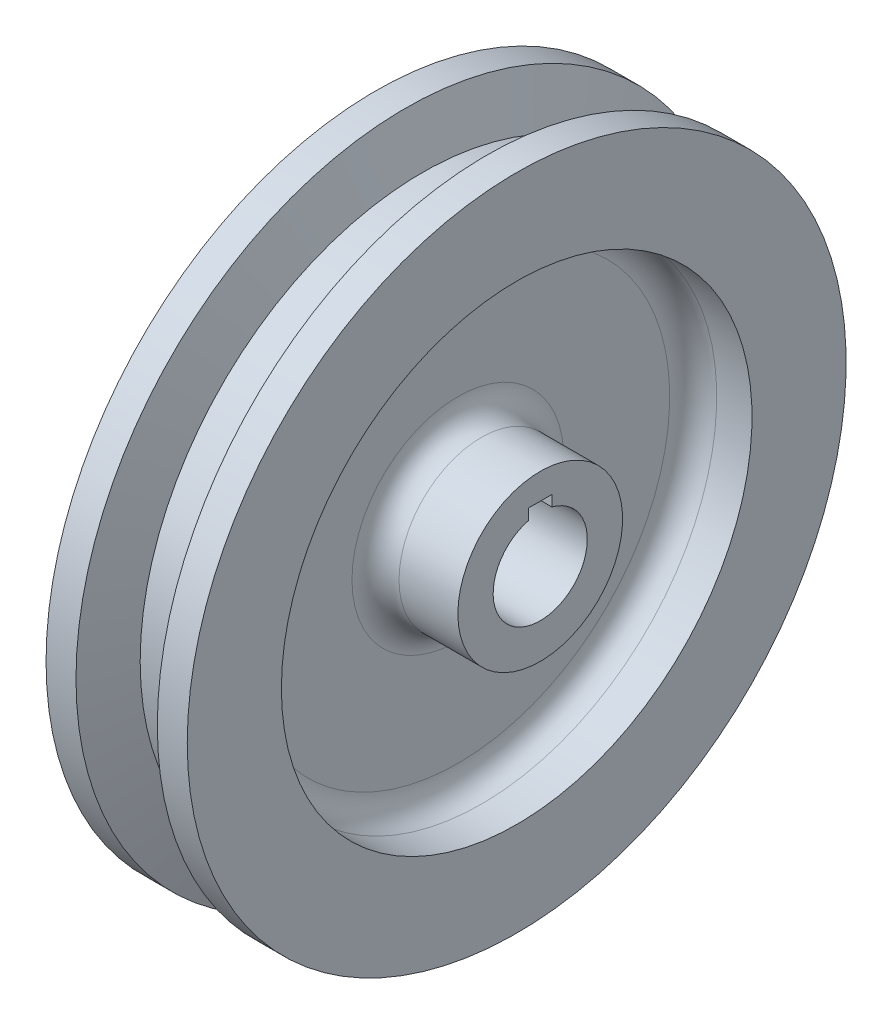
ISO-10303-21;
HEADER;
FILE_DESCRIPTION(('STEP AP214'),'2;1');
FILE_NAME('part.step','',(''),(''),'','','');
FILE_SCHEMA(('AUTOMOTIVE_DESIGN { 1 0 10303 214 1 1 1 1 }'));
ENDSEC;
DATA;
#1=APPLICATION_CONTEXT('core data for automotive mechanical design processes');
#2=APPLICATION_PROTOCOL_DEFINITION('international standard','automotive_design',2000,#1);
#3=PRODUCT_CONTEXT('',#1,'mechanical');
#4=PRODUCT('Part','Part','',(#3));
#5=PRODUCT_RELATED_PRODUCT_CATEGORY('part','',(#4));
#6=PRODUCT_DEFINITION_FORMATION('','',#4);
#7=PRODUCT_DEFINITION_CONTEXT('part definition',#1,'design');
#8=PRODUCT_DEFINITION('design','',#6,#7);
#9=PRODUCT_DEFINITION_SHAPE('','',#8);
#10=(LENGTH_UNIT() NAMED_UNIT(*) SI_UNIT(.MILLI.,.METRE.));
#11=(NAMED_UNIT(*) PLANE_ANGLE_UNIT() SI_UNIT($,.RADIAN.));
#12=(NAMED_UNIT(*) SI_UNIT($,.STERADIAN.) SOLID_ANGLE_UNIT());
#13=UNCERTAINTY_MEASURE_WITH_UNIT(LENGTH_MEASURE(1.E-05),#10,'distance_accuracy_value','');
#14=(GEOMETRIC_REPRESENTATION_CONTEXT(3) GLOBAL_UNCERTAINTY_ASSIGNED_CONTEXT((#13)) GLOBAL_UNIT_ASSIGNED_CONTEXT((#10,
#11,#12)) REPRESENTATION_CONTEXT('',''));
#15=CARTESIAN_POINT('',(0.,0.,0.));
#16=DIRECTION('',(0.,0.,1.));
#17=DIRECTION('',(1.,0.,0.));
#18=AXIS2_PLACEMENT_3D('',#15,#16,#17);
#19=CARTESIAN_POINT('',(-25.4,9.525,0.));
#20=DIRECTION('',(1.,0.,0.));
#21=DIRECTION('',(0.,0.,-1.));
#22=AXIS2_PLACEMENT_3D('',#19,#20,#21);
#23=PLANE('',#22);
#24=CARTESIAN_POINT('',(-25.4,-12.7,0.));
#25=DIRECTION('',(-1.,0.,0.));
#26=DIRECTION('',(0.,0.,1.));
#27=AXIS2_PLACEMENT_3D('',#24,#25,#26);
#28=CIRCLE('',#27,22.225);
#29=CARTESIAN_POINT('',(-25.4,-12.7,22.225));
#30=VERTEX_POINT('',#29);
#31=EDGE_CURVE('E11',#30,#30,#28,.T.);
#32=ORIENTED_EDGE('',*,*,#31,.T.);
#33=EDGE_LOOP('',(#32));
#34=FACE_BOUND('',#33,.T.);
#35=DIRECTION('',(0.,1.,0.));
#36=VECTOR('',#35,1.);
#37=CARTESIAN_POINT('',(-25.4,-0.403277875791438,3.17499999999999));
#38=LINE('',#37,#36);
#39=CARTESIAN_POINT('',(-25.4,-0.403277875791438,3.17499999999999));
#40=VERTEX_POINT('',#39);
#41=CARTESIAN_POINT('',(-25.4,2.54,3.17499999999999));
#42=VERTEX_POINT('',#41);
#43=EDGE_CURVE('E77',#40,#42,#38,.T.);
#44=ORIENTED_EDGE('',*,*,#43,.F.);
#45=CARTESIAN_POINT('',(-25.4,-12.7,0.));
#46=DIRECTION('',(-1.,0.,0.));
#47=DIRECTION('',(0.,0.,1.));
#48=AXIS2_PLACEMENT_3D('',#45,#46,#47);
#49=CIRCLE('',#48,12.7);
#50=CARTESIAN_POINT('',(-25.4,-0.403277875791454,-3.17500000000001));
#51=VERTEX_POINT('',#50);
#52=EDGE_CURVE('E80',#51,#40,#49,.T.);
#53=ORIENTED_EDGE('',*,*,#52,.F.);
#54=DIRECTION('',(0.,-1.,0.));
#55=VECTOR('',#54,1.);
#56=CARTESIAN_POINT('',(-25.4,2.54,-3.17500000000001));
#57=LINE('',#56,#55);
#58=CARTESIAN_POINT('',(-25.4,2.54,-3.17500000000001));
#59=VERTEX_POINT('',#58);
#60=EDGE_CURVE('E47',#59,#51,#57,.T.);
#61=ORIENTED_EDGE('',*,*,#60,.F.);
#62=DIRECTION('',(0.,0.,-1.));
#63=VECTOR('',#62,1.);
#64=CARTESIAN_POINT('',(-25.4,2.54,3.17499999999999));
#65=LINE('',#64,#63);
#66=EDGE_CURVE('E99',#42,#59,#65,.T.);
#67=ORIENTED_EDGE('',*,*,#66,.F.);
#68=EDGE_LOOP('',(#44,#53,#61,#67));
#69=FACE_BOUND('',#68,.T.);
#70=ADVANCED_FACE('F33',(#34,#69),#23,.F.);
#71=CARTESIAN_POINT('',(25.4,0.,0.));
#72=DIRECTION('',(-1.,0.,0.));
#73=DIRECTION('',(0.,0.,1.));
#74=AXIS2_PLACEMENT_3D('',#71,#72,#73);
#75=PLANE('',#74);
#76=CARTESIAN_POINT('',(25.4,-12.7,0.));
#77=DIRECTION('',(-1.,0.,0.));
#78=DIRECTION('',(0.,0.,1.));
#79=AXIS2_PLACEMENT_3D('',#76,#77,#78);
#80=CIRCLE('',#79,22.225);
#81=CARTESIAN_POINT('',(25.4,-12.7,22.225));
#82=VERTEX_POINT('',#81);
#83=EDGE_CURVE('E109',#82,#82,#80,.T.);
#84=ORIENTED_EDGE('',*,*,#83,.F.);
#85=EDGE_LOOP('',(#84));
#86=FACE_BOUND('',#85,.T.);
#87=DIRECTION('',(0.,1.,0.));
#88=VECTOR('',#87,1.);
#89=CARTESIAN_POINT('',(25.4,-0.403277875791438,3.17499999999999));
#90=LINE('',#89,#88);
#91=CARTESIAN_POINT('',(25.4,-0.403277875791438,3.17499999999999));
#92=VERTEX_POINT('',#91);
#93=CARTESIAN_POINT('',(25.4,2.54,3.17499999999999));
#94=VERTEX_POINT('',#93);
#95=EDGE_CURVE('E76',#92,#94,#90,.T.);
#96=ORIENTED_EDGE('',*,*,#95,.T.);
#97=DIRECTION('',(0.,0.,-1.));
#98=VECTOR('',#97,1.);
#99=CARTESIAN_POINT('',(25.4,2.54,3.17499999999999));
#100=LINE('',#99,#98);
#101=CARTESIAN_POINT('',(25.4,2.54,-3.17500000000001));
#102=VERTEX_POINT('',#101);
#103=EDGE_CURVE('E84',#94,#102,#100,.T.);
#104=ORIENTED_EDGE('',*,*,#103,.T.);
#105=DIRECTION('',(0.,-1.,0.));
#106=VECTOR('',#105,1.);
#107=CARTESIAN_POINT('',(25.4,2.54,-3.17500000000001));
#108=LINE('',#107,#106);
#109=CARTESIAN_POINT('',(25.4,-0.403277875791437,-3.17500000000001));
#110=VERTEX_POINT('',#109);
#111=EDGE_CURVE('E89',#102,#110,#108,.T.);
#112=ORIENTED_EDGE('',*,*,#111,.T.);
#113=CARTESIAN_POINT('',(25.4,-12.7,0.));
#114=DIRECTION('',(-1.,0.,0.));
#115=DIRECTION('',(0.,0.,1.));
#116=AXIS2_PLACEMENT_3D('',#113,#114,#115);
#117=CIRCLE('',#116,12.7);
#118=EDGE_CURVE('E94',#110,#92,#117,.T.);
#119=ORIENTED_EDGE('',*,*,#118,.T.);
#120=EDGE_LOOP('',(#96,#104,#112,#119));
#121=FACE_BOUND('',#120,.T.);
#122=ADVANCED_FACE('F92',(#86,#121),#75,.F.);
#123=CARTESIAN_POINT('',(-43.2740740740741,-12.7,0.));
#124=DIRECTION('',(-1.,0.,0.));
#125=DIRECTION('',(0.,0.,1.));
#126=AXIS2_PLACEMENT_3D('',#123,#124,#125);
#127=CYLINDRICAL_SURFACE('',#126,22.225);
#128=ORIENTED_EDGE('',*,*,#31,.F.);
#129=EDGE_LOOP('',(#128));
#130=FACE_BOUND('',#129,.T.);
#131=CARTESIAN_POINT('',(-9.52500000000004,-12.7,0.));
#132=DIRECTION('',(-1.,0.,0.));
#133=DIRECTION('',(0.,0.,1.));
#134=AXIS2_PLACEMENT_3D('',#131,#132,#133);
#135=CIRCLE('',#134,22.225);
#136=CARTESIAN_POINT('',(-9.52500000000004,-12.7,22.225));
#137=VERTEX_POINT('',#136);
#138=EDGE_CURVE('E40',#137,#137,#135,.T.);
#139=ORIENTED_EDGE('',*,*,#138,.T.);
#140=EDGE_LOOP('',(#139));
#141=FACE_BOUND('',#140,.T.);
#142=ADVANCED_FACE('F159',(#130,#141),#127,.T.);
#143=CARTESIAN_POINT('',(-9.525,-12.7,0.));
#144=DIRECTION('',(-1.,0.,0.));
#145=DIRECTION('',(0.,0.,1.));
#146=AXIS2_PLACEMENT_3D('',#143,#144,#145);
#147=TOROIDAL_SURFACE('',#146,28.575,6.35);
#148=ORIENTED_EDGE('',*,*,#138,.F.);
#149=EDGE_LOOP('',(#148));
#150=FACE_BOUND('',#149,.T.);
#151=CARTESIAN_POINT('',(-3.175,-12.7,0.));
#152=DIRECTION('',(-1.,0.,0.));
#153=DIRECTION('',(0.,0.,1.));
#154=AXIS2_PLACEMENT_3D('',#151,#152,#153);
#155=CIRCLE('',#154,28.575);
#156=CARTESIAN_POINT('',(-3.175,-12.7,28.575));
#157=VERTEX_POINT('',#156);
#158=EDGE_CURVE('E154',#157,#157,#155,.T.);
#159=ORIENTED_EDGE('',*,*,#158,.T.);
#160=EDGE_LOOP('',(#159));
#161=FACE_BOUND('',#160,.T.);
#162=ADVANCED_FACE('F161',(#150,#161),#147,.F.);
#163=CARTESIAN_POINT('',(-3.175,44.45,0.));
#164=DIRECTION('',(1.,0.,0.));
#165=DIRECTION('',(0.,0.,-1.));
#166=AXIS2_PLACEMENT_3D('',#163,#164,#165);
#167=PLANE('',#166);
#168=ORIENTED_EDGE('',*,*,#158,.F.);
#169=EDGE_LOOP('',(#168));
#170=FACE_BOUND('',#169,.T.);
#171=CARTESIAN_POINT('',(-3.175,-12.7,0.));
#172=DIRECTION('',(-1.,0.,0.));
#173=DIRECTION('',(0.,0.,1.));
#174=AXIS2_PLACEMENT_3D('',#171,#172,#173);
#175=CIRCLE('',#174,57.15);
#176=CARTESIAN_POINT('',(-3.175,-12.7,57.15));
#177=VERTEX_POINT('',#176);
#178=EDGE_CURVE('E151',#177,#177,#175,.T.);
#179=ORIENTED_EDGE('',*,*,#178,.T.);
#180=EDGE_LOOP('',(#179));
#181=FACE_BOUND('',#180,.T.);
#182=ADVANCED_FACE('F164',(#170,#181),#167,.F.);
#183=CARTESIAN_POINT('',(-9.525,-12.7,0.));
#184=DIRECTION('',(-1.,0.,0.));
#185=DIRECTION('',(0.,0.,1.));
#186=AXIS2_PLACEMENT_3D('',#183,#184,#185);
#187=TOROIDAL_SURFACE('',#186,57.15,6.35);
#188=ORIENTED_EDGE('',*,*,#178,.F.);
#189=EDGE_LOOP('',(#188));
#190=FACE_BOUND('',#189,.T.);
#191=CARTESIAN_POINT('',(-9.52500000000005,-12.7,0.));
#192=DIRECTION('',(-1.,0.,0.));
#193=DIRECTION('',(0.,0.,1.));
#194=AXIS2_PLACEMENT_3D('',#191,#192,#193);
#195=CIRCLE('',#194,63.5);
#196=CARTESIAN_POINT('',(-9.52500000000005,-12.7,63.5));
#197=VERTEX_POINT('',#196);
#198=EDGE_CURVE('E148',#197,#197,#195,.T.);
#199=ORIENTED_EDGE('',*,*,#198,.T.);
#200=EDGE_LOOP('',(#199));
#201=FACE_BOUND('',#200,.T.);
#202=ADVANCED_FACE('F170',(#190,#201),#187,.F.);
#203=CARTESIAN_POINT('',(-43.2740740740741,-12.7,0.));
#204=DIRECTION('',(-1.,0.,0.));
#205=DIRECTION('',(0.,0.,1.));
#206=AXIS2_PLACEMENT_3D('',#203,#204,#205);
#207=CYLINDRICAL_SURFACE('',#206,63.5);
#208=ORIENTED_EDGE('',*,*,#198,.F.);
#209=EDGE_LOOP('',(#208));
#210=FACE_BOUND('',#209,.T.);
#211=CARTESIAN_POINT('',(-19.05,-12.7,0.));
#212=DIRECTION('',(-1.,0.,0.));
#213=DIRECTION('',(0.,0.,1.));
#214=AXIS2_PLACEMENT_3D('',#211,#212,#213);
#215=CIRCLE('',#214,63.5);
#216=CARTESIAN_POINT('',(-19.05,-12.7,63.5));
#217=VERTEX_POINT('',#216);
#218=EDGE_CURVE('E145',#217,#217,#215,.T.);
#219=ORIENTED_EDGE('',*,*,#218,.T.);
#220=EDGE_LOOP('',(#219));
#221=FACE_BOUND('',#220,.T.);
#222=ADVANCED_FACE('F176',(#210,#221),#207,.F.);
#223=CARTESIAN_POINT('',(-19.05,76.2,0.));
#224=DIRECTION('',(1.,0.,0.));
#225=DIRECTION('',(0.,0.,-1.));
#226=AXIS2_PLACEMENT_3D('',#223,#224,#225);
#227=PLANE('',#226);
#228=ORIENTED_EDGE('',*,*,#218,.F.);
#229=EDGE_LOOP('',(#228));
#230=FACE_BOUND('',#229,.T.);
#231=CARTESIAN_POINT('',(-19.05,-12.7,0.));
#232=DIRECTION('',(-1.,0.,0.));
#233=DIRECTION('',(0.,0.,1.));
#234=AXIS2_PLACEMENT_3D('',#231,#232,#233);
#235=CIRCLE('',#234,88.9);
#236=CARTESIAN_POINT('',(-19.05,-12.7,88.9));
#237=VERTEX_POINT('',#236);
#238=EDGE_CURVE('E142',#237,#237,#235,.T.);
#239=ORIENTED_EDGE('',*,*,#238,.T.);
#240=EDGE_LOOP('',(#239));
#241=FACE_BOUND('',#240,.T.);
#242=ADVANCED_FACE('F182',(#230,#241),#227,.F.);
#243=CARTESIAN_POINT('',(-43.2740740740741,-12.7,0.));
#244=DIRECTION('',(-1.,0.,0.));
#245=DIRECTION('',(0.,0.,1.));
#246=AXIS2_PLACEMENT_3D('',#243,#244,#245);
#247=CYLINDRICAL_SURFACE('',#246,88.9);
#248=ORIENTED_EDGE('',*,*,#238,.F.);
#249=EDGE_LOOP('',(#248));
#250=FACE_BOUND('',#249,.T.);
#251=CARTESIAN_POINT('',(-10.9724219751807,-12.7,0.));
#252=DIRECTION('',(-1.,0.,0.));
#253=DIRECTION('',(0.,0.,1.));
#254=AXIS2_PLACEMENT_3D('',#251,#252,#253);
#255=CIRCLE('',#254,88.9);
#256=CARTESIAN_POINT('',(-10.9724219751807,-12.7,88.9));
#257=VERTEX_POINT('',#256);
#258=EDGE_CURVE('E139',#257,#257,#255,.T.);
#259=ORIENTED_EDGE('',*,*,#258,.T.);
#260=EDGE_LOOP('',(#259));
#261=FACE_BOUND('',#260,.T.);
#262=ADVANCED_FACE('F188',(#250,#261),#247,.T.);
#263=CARTESIAN_POINT('',(-6.35,-12.7,0.));
#264=DIRECTION('',(-1.,0.,0.));
#265=DIRECTION('',(0.,0.,1.));
#266=AXIS2_PLACEMENT_3D('',#263,#264,#265);
#267=CONICAL_SURFACE('',#266,76.2,1.22173047639603);
#268=ORIENTED_EDGE('',*,*,#258,.F.);
#269=EDGE_LOOP('',(#268));
#270=FACE_BOUND('',#269,.T.);
#271=CARTESIAN_POINT('',(-6.35,-12.7,0.));
#272=DIRECTION('',(-1.,0.,0.));
#273=DIRECTION('',(0.,0.,1.));
#274=AXIS2_PLACEMENT_3D('',#271,#272,#273);
#275=CIRCLE('',#274,76.2);
#276=CARTESIAN_POINT('',(-6.35,-12.7,76.2));
#277=VERTEX_POINT('',#276);
#278=EDGE_CURVE('E136',#277,#277,#275,.T.);
#279=ORIENTED_EDGE('',*,*,#278,.T.);
#280=EDGE_LOOP('',(#279));
#281=FACE_BOUND('',#280,.T.);
#282=ADVANCED_FACE('F194',(#270,#281),#267,.T.);
#283=CARTESIAN_POINT('',(-43.2740740740741,-12.7,0.));
#284=DIRECTION('',(-1.,0.,0.));
#285=DIRECTION('',(0.,0.,1.));
#286=AXIS2_PLACEMENT_3D('',#283,#284,#285);
#287=CYLINDRICAL_SURFACE('',#286,76.2);
#288=ORIENTED_EDGE('',*,*,#278,.F.);
#289=EDGE_LOOP('',(#288));
#290=FACE_BOUND('',#289,.T.);
#291=CARTESIAN_POINT('',(6.34999999999999,-12.7,0.));
#292=DIRECTION('',(-1.,0.,0.));
#293=DIRECTION('',(0.,0.,1.));
#294=AXIS2_PLACEMENT_3D('',#291,#292,#293);
#295=CIRCLE('',#294,76.2);
#296=CARTESIAN_POINT('',(6.34999999999999,-12.7,76.2));
#297=VERTEX_POINT('',#296);
#298=EDGE_CURVE('E133',#297,#297,#295,.T.);
#299=ORIENTED_EDGE('',*,*,#298,.T.);
#300=EDGE_LOOP('',(#299));
#301=FACE_BOUND('',#300,.T.);
#302=ADVANCED_FACE('F200',(#290,#301),#287,.T.);
#303=CARTESIAN_POINT('',(10.9724219751807,-12.7,0.));
#304=DIRECTION('',(1.,0.,0.));
#305=DIRECTION('',(0.,0.,-1.));
#306=AXIS2_PLACEMENT_3D('',#303,#304,#305);
#307=CONICAL_SURFACE('',#306,88.9,1.22173047639603);
#308=ORIENTED_EDGE('',*,*,#298,.F.);
#309=EDGE_LOOP('',(#308));
#310=FACE_BOUND('',#309,.T.);
#311=CARTESIAN_POINT('',(10.9724219751807,-12.7,0.));
#312=DIRECTION('',(-1.,0.,0.));
#313=DIRECTION('',(0.,0.,1.));
#314=AXIS2_PLACEMENT_3D('',#311,#312,#313);
#315=CIRCLE('',#314,88.9);
#316=CARTESIAN_POINT('',(10.9724219751807,-12.7,88.9));
#317=VERTEX_POINT('',#316);
#318=EDGE_CURVE('E130',#317,#317,#315,.T.);
#319=ORIENTED_EDGE('',*,*,#318,.T.);
#320=EDGE_LOOP('',(#319));
#321=FACE_BOUND('',#320,.T.);
#322=ADVANCED_FACE('F206',(#310,#321),#307,.T.);
#323=CARTESIAN_POINT('',(-43.2740740740741,-12.7,0.));
#324=DIRECTION('',(-1.,0.,0.));
#325=DIRECTION('',(0.,0.,1.));
#326=AXIS2_PLACEMENT_3D('',#323,#324,#325);
#327=CYLINDRICAL_SURFACE('',#326,88.9);
#328=ORIENTED_EDGE('',*,*,#318,.F.);
#329=EDGE_LOOP('',(#328));
#330=FACE_BOUND('',#329,.T.);
#331=CARTESIAN_POINT('',(19.05,-12.7,0.));
#332=DIRECTION('',(-1.,0.,0.));
#333=DIRECTION('',(0.,0.,1.));
#334=AXIS2_PLACEMENT_3D('',#331,#332,#333);
#335=CIRCLE('',#334,88.9);
#336=CARTESIAN_POINT('',(19.05,-12.7,88.9));
#337=VERTEX_POINT('',#336);
#338=EDGE_CURVE('E127',#337,#337,#335,.T.);
#339=ORIENTED_EDGE('',*,*,#338,.T.);
#340=EDGE_LOOP('',(#339));
#341=FACE_BOUND('',#340,.T.);
#342=ADVANCED_FACE('F212',(#330,#341),#327,.T.);
#343=CARTESIAN_POINT('',(19.05,50.8,0.));
#344=DIRECTION('',(-1.,0.,0.));
#345=DIRECTION('',(0.,0.,1.));
#346=AXIS2_PLACEMENT_3D('',#343,#344,#345);
#347=PLANE('',#346);
#348=ORIENTED_EDGE('',*,*,#338,.F.);
#349=EDGE_LOOP('',(#348));
#350=FACE_BOUND('',#349,.T.);
#351=CARTESIAN_POINT('',(19.05,-12.7,0.));
#352=DIRECTION('',(-1.,0.,0.));
#353=DIRECTION('',(0.,0.,1.));
#354=AXIS2_PLACEMENT_3D('',#351,#352,#353);
#355=CIRCLE('',#354,63.5);
#356=CARTESIAN_POINT('',(19.05,-12.7,63.5));
#357=VERTEX_POINT('',#356);
#358=EDGE_CURVE('E124',#357,#357,#355,.T.);
#359=ORIENTED_EDGE('',*,*,#358,.T.);
#360=EDGE_LOOP('',(#359));
#361=FACE_BOUND('',#360,.T.);
#362=ADVANCED_FACE('F218',(#350,#361),#347,.F.);
#363=CARTESIAN_POINT('',(-43.2740740740741,-12.7,0.));
#364=DIRECTION('',(-1.,0.,0.));
#365=DIRECTION('',(0.,0.,1.));
#366=AXIS2_PLACEMENT_3D('',#363,#364,#365);
#367=CYLINDRICAL_SURFACE('',#366,63.5);
#368=ORIENTED_EDGE('',*,*,#358,.F.);
#369=EDGE_LOOP('',(#368));
#370=FACE_BOUND('',#369,.T.);
#371=CARTESIAN_POINT('',(9.52500000000004,-12.7,0.));
#372=DIRECTION('',(-1.,0.,0.));
#373=DIRECTION('',(0.,0.,1.));
#374=AXIS2_PLACEMENT_3D('',#371,#372,#373);
#375=CIRCLE('',#374,63.5);
#376=CARTESIAN_POINT('',(9.52500000000004,-12.7,63.5));
#377=VERTEX_POINT('',#376);
#378=EDGE_CURVE('E121',#377,#377,#375,.T.);
#379=ORIENTED_EDGE('',*,*,#378,.T.);
#380=EDGE_LOOP('',(#379));
#381=FACE_BOUND('',#380,.T.);
#382=ADVANCED_FACE('F224',(#370,#381),#367,.F.);
#383=CARTESIAN_POINT('',(9.525,-12.7,0.));
#384=DIRECTION('',(-1.,0.,0.));
#385=DIRECTION('',(0.,0.,1.));
#386=AXIS2_PLACEMENT_3D('',#383,#384,#385);
#387=TOROIDAL_SURFACE('',#386,57.15,6.35);
#388=ORIENTED_EDGE('',*,*,#378,.F.);
#389=EDGE_LOOP('',(#388));
#390=FACE_BOUND('',#389,.T.);
#391=CARTESIAN_POINT('',(3.175,-12.7,0.));
#392=DIRECTION('',(-1.,0.,0.));
#393=DIRECTION('',(0.,0.,1.));
#394=AXIS2_PLACEMENT_3D('',#391,#392,#393);
#395=CIRCLE('',#394,57.15);
#396=CARTESIAN_POINT('',(3.175,-12.7,57.15));
#397=VERTEX_POINT('',#396);
#398=EDGE_CURVE('E118',#397,#397,#395,.T.);
#399=ORIENTED_EDGE('',*,*,#398,.T.);
#400=EDGE_LOOP('',(#399));
#401=FACE_BOUND('',#400,.T.);
#402=ADVANCED_FACE('F230',(#390,#401),#387,.F.);
#403=CARTESIAN_POINT('',(3.175,15.875,0.));
#404=DIRECTION('',(-1.,0.,0.));
#405=DIRECTION('',(0.,0.,1.));
#406=AXIS2_PLACEMENT_3D('',#403,#404,#405);
#407=PLANE('',#406);
#408=ORIENTED_EDGE('',*,*,#398,.F.);
#409=EDGE_LOOP('',(#408));
#410=FACE_BOUND('',#409,.T.);
#411=CARTESIAN_POINT('',(3.175,-12.7,0.));
#412=DIRECTION('',(-1.,0.,0.));
#413=DIRECTION('',(0.,0.,1.));
#414=AXIS2_PLACEMENT_3D('',#411,#412,#413);
#415=CIRCLE('',#414,28.575);
#416=CARTESIAN_POINT('',(3.175,-12.7,28.575));
#417=VERTEX_POINT('',#416);
#418=EDGE_CURVE('E115',#417,#417,#415,.T.);
#419=ORIENTED_EDGE('',*,*,#418,.T.);
#420=EDGE_LOOP('',(#419));
#421=FACE_BOUND('',#420,.T.);
#422=ADVANCED_FACE('F236',(#410,#421),#407,.F.);
#423=CARTESIAN_POINT('',(9.525,-12.7,0.));
#424=DIRECTION('',(-1.,0.,0.));
#425=DIRECTION('',(0.,0.,1.));
#426=AXIS2_PLACEMENT_3D('',#423,#424,#425);
#427=TOROIDAL_SURFACE('',#426,28.575,6.35);
#428=ORIENTED_EDGE('',*,*,#418,.F.);
#429=EDGE_LOOP('',(#428));
#430=FACE_BOUND('',#429,.T.);
#431=CARTESIAN_POINT('',(9.52500000000005,-12.7,0.));
#432=DIRECTION('',(-1.,0.,0.));
#433=DIRECTION('',(0.,0.,1.));
#434=AXIS2_PLACEMENT_3D('',#431,#432,#433);
#435=CIRCLE('',#434,22.225);
#436=CARTESIAN_POINT('',(9.52500000000005,-12.7,22.225));
#437=VERTEX_POINT('',#436);
#438=EDGE_CURVE('E112',#437,#437,#435,.T.);
#439=ORIENTED_EDGE('',*,*,#438,.T.);
#440=EDGE_LOOP('',(#439));
#441=FACE_BOUND('',#440,.T.);
#442=ADVANCED_FACE('F242',(#430,#441),#427,.F.);
#443=CARTESIAN_POINT('',(-43.2740740740741,-12.7,0.));
#444=DIRECTION('',(-1.,0.,0.));
#445=DIRECTION('',(0.,0.,1.));
#446=AXIS2_PLACEMENT_3D('',#443,#444,#445);
#447=CYLINDRICAL_SURFACE('',#446,22.225);
#448=ORIENTED_EDGE('',*,*,#438,.F.);
#449=EDGE_LOOP('',(#448));
#450=FACE_BOUND('',#449,.T.);
#451=ORIENTED_EDGE('',*,*,#83,.T.);
#452=EDGE_LOOP('',(#451));
#453=FACE_BOUND('',#452,.T.);
#454=ADVANCED_FACE('F248',(#450,#453),#447,.T.);
#455=CARTESIAN_POINT('',(-43.2740740740741,-12.7,0.));
#456=DIRECTION('',(-1.,0.,0.));
#457=DIRECTION('',(0.,0.,1.));
#458=AXIS2_PLACEMENT_3D('',#455,#456,#457);
#459=CYLINDRICAL_SURFACE('',#458,12.7);
#460=ORIENTED_EDGE('',*,*,#52,.T.);
#461=DIRECTION('',(1.,0.,0.));
#462=VECTOR('',#461,1.);
#463=CARTESIAN_POINT('',(-25.4,-0.403277875791438,3.17499999999999));
#464=LINE('',#463,#462);
#465=EDGE_CURVE('E55',#40,#92,#464,.T.);
#466=ORIENTED_EDGE('',*,*,#465,.T.);
#467=ORIENTED_EDGE('',*,*,#118,.F.);
#468=DIRECTION('',(1.,0.,0.));
#469=VECTOR('',#468,1.);
#470=CARTESIAN_POINT('',(-25.4,-0.403277875791437,-3.17500000000001));
#471=LINE('',#470,#469);
#472=EDGE_CURVE('E103',#51,#110,#471,.T.);
#473=ORIENTED_EDGE('',*,*,#472,.F.);
#474=EDGE_LOOP('',(#460,#466,#467,#473));
#475=FACE_BOUND('',#474,.T.);
#476=ADVANCED_FACE('F254',(#475),#459,.F.);
#477=CARTESIAN_POINT('',(-25.4,-0.403277875791438,3.17499999999999));
#478=DIRECTION('',(0.,0.,-1.));
#479=DIRECTION('',(0.,1.,0.));
#480=AXIS2_PLACEMENT_3D('',#477,#478,#479);
#481=PLANE('',#480);
#482=ORIENTED_EDGE('',*,*,#465,.F.);
#483=ORIENTED_EDGE('',*,*,#43,.T.);
#484=DIRECTION('',(1.,0.,0.));
#485=VECTOR('',#484,1.);
#486=CARTESIAN_POINT('',(-25.4,2.54,3.17499999999999));
#487=LINE('',#486,#485);
#488=EDGE_CURVE('E72',#42,#94,#487,.T.);
#489=ORIENTED_EDGE('',*,*,#488,.T.);
#490=ORIENTED_EDGE('',*,*,#95,.F.);
#491=EDGE_LOOP('',(#482,#483,#489,#490));
#492=FACE_BOUND('',#491,.T.);
#493=ADVANCED_FACE('F74',(#492),#481,.T.);
#494=CARTESIAN_POINT('',(-25.4,2.54,3.17499999999999));
#495=DIRECTION('',(0.,-1.,0.));
#496=DIRECTION('',(0.,0.,-1.));
#497=AXIS2_PLACEMENT_3D('',#494,#495,#496);
#498=PLANE('',#497);
#499=ORIENTED_EDGE('',*,*,#488,.F.);
#500=ORIENTED_EDGE('',*,*,#66,.T.);
#501=DIRECTION('',(1.,0.,0.));
#502=VECTOR('',#501,1.);
#503=CARTESIAN_POINT('',(-25.4,2.54,-3.17500000000001));
#504=LINE('',#503,#502);
#505=EDGE_CURVE('E81',#59,#102,#504,.T.);
#506=ORIENTED_EDGE('',*,*,#505,.T.);
#507=ORIENTED_EDGE('',*,*,#103,.F.);
#508=EDGE_LOOP('',(#499,#500,#506,#507));
#509=FACE_BOUND('',#508,.T.);
#510=ADVANCED_FACE('F85',(#509),#498,.T.);
#511=CARTESIAN_POINT('',(-25.4,2.54,-3.17500000000001));
#512=DIRECTION('',(0.,0.,1.));
#513=DIRECTION('',(0.,-1.,0.));
#514=AXIS2_PLACEMENT_3D('',#511,#512,#513);
#515=PLANE('',#514);
#516=ORIENTED_EDGE('',*,*,#505,.F.);
#517=ORIENTED_EDGE('',*,*,#60,.T.);
#518=ORIENTED_EDGE('',*,*,#472,.T.);
#519=ORIENTED_EDGE('',*,*,#111,.F.);
#520=EDGE_LOOP('',(#516,#517,#518,#519));
#521=FACE_BOUND('',#520,.T.);
#522=ADVANCED_FACE('F274',(#521),#515,.T.);
#523=CLOSED_SHELL('',(#70,#122,#142,#162,#182,#202,#222,#242,#262,#282,#302,#322,#342,#362,#382,
#402,#422,#442,#454,#476,#493,#510,#522));
#524=MANIFOLD_SOLID_BREP('B2',#523);
#525=ADVANCED_BREP_SHAPE_REPRESENTATION('',(#18,#524),#14);
#526=SHAPE_DEFINITION_REPRESENTATION(#9,#525);
ENDSEC;
END-ISO-10303-21;
